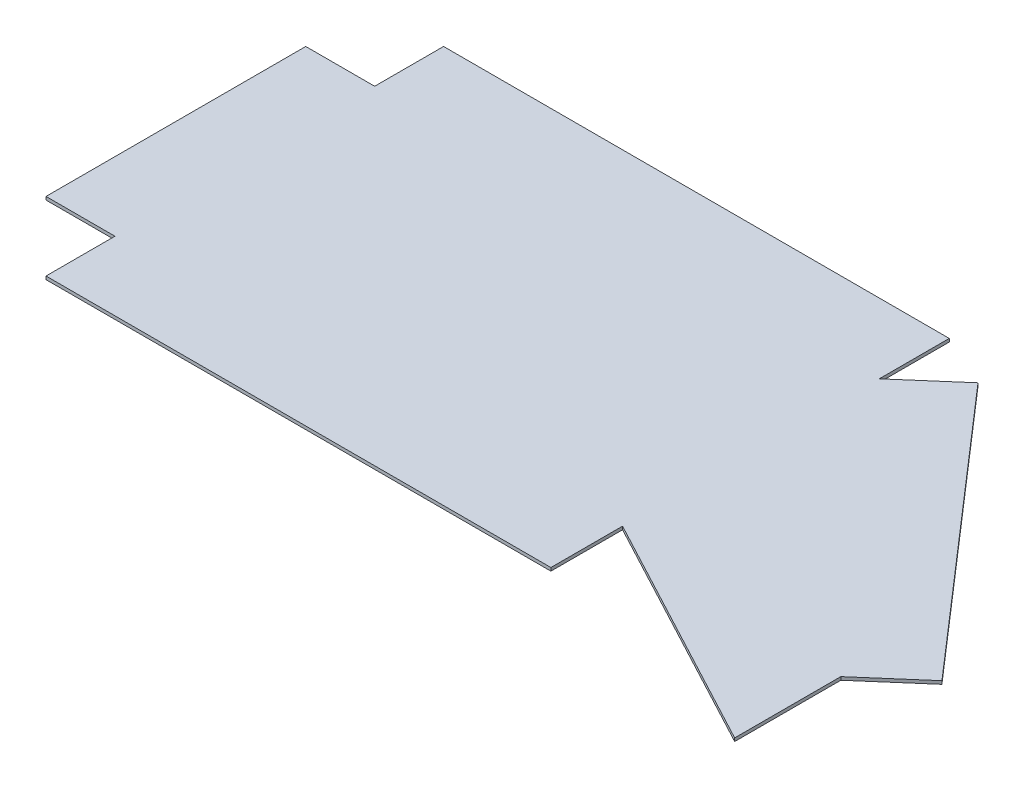
ISO-10303-21;
HEADER;
FILE_DESCRIPTION(('STEP AP214'),'2;1');
FILE_NAME('part.step','',(''),(''),'','','');
FILE_SCHEMA(('AUTOMOTIVE_DESIGN { 1 0 10303 214 1 1 1 1 }'));
ENDSEC;
DATA;
#1=APPLICATION_CONTEXT('core data for automotive mechanical design processes');
#2=APPLICATION_PROTOCOL_DEFINITION('international standard','automotive_design',2000,#1);
#3=PRODUCT_CONTEXT('',#1,'mechanical');
#4=PRODUCT('Part','Part','',(#3));
#5=PRODUCT_RELATED_PRODUCT_CATEGORY('part','',(#4));
#6=PRODUCT_DEFINITION_FORMATION('','',#4);
#7=PRODUCT_DEFINITION_CONTEXT('part definition',#1,'design');
#8=PRODUCT_DEFINITION('design','',#6,#7);
#9=PRODUCT_DEFINITION_SHAPE('','',#8);
#10=(LENGTH_UNIT() NAMED_UNIT(*) SI_UNIT(.MILLI.,.METRE.));
#11=(NAMED_UNIT(*) PLANE_ANGLE_UNIT() SI_UNIT($,.RADIAN.));
#12=(NAMED_UNIT(*) SI_UNIT($,.STERADIAN.) SOLID_ANGLE_UNIT());
#13=UNCERTAINTY_MEASURE_WITH_UNIT(LENGTH_MEASURE(1.E-05),#10,'distance_accuracy_value','');
#14=(GEOMETRIC_REPRESENTATION_CONTEXT(3) GLOBAL_UNCERTAINTY_ASSIGNED_CONTEXT((#13)) GLOBAL_UNIT_ASSIGNED_CONTEXT((#10,
#11,#12)) REPRESENTATION_CONTEXT('',''));
#15=CARTESIAN_POINT('',(0.,0.,0.));
#16=DIRECTION('',(0.,0.,1.));
#17=DIRECTION('',(1.,0.,0.));
#18=AXIS2_PLACEMENT_3D('',#15,#16,#17);
#19=CARTESIAN_POINT('',(0.,1.5,9.99163001597254));
#20=DIRECTION('',(-1.,0.,0.));
#21=DIRECTION('',(0.,0.,1.));
#22=AXIS2_PLACEMENT_3D('',#19,#20,#21);
#23=PLANE('',#22);
#24=DIRECTION('',(0.,0.,-1.));
#25=VECTOR('',#24,1.);
#26=CARTESIAN_POINT('',(0.,0.,9.99163001597254));
#27=LINE('',#26,#25);
#28=CARTESIAN_POINT('',(0.,0.,60.0831657777462));
#29=VERTEX_POINT('',#28);
#30=CARTESIAN_POINT('',(0.,0.,9.99163001597256));
#31=VERTEX_POINT('',#30);
#32=EDGE_CURVE('E410',#29,#31,#27,.T.);
#33=ORIENTED_EDGE('',*,*,#32,.T.);
#34=DIRECTION('',(0.,-1.,0.));
#35=VECTOR('',#34,1.);
#36=CARTESIAN_POINT('',(0.,1.5,9.99163001597254));
#37=LINE('',#36,#35);
#38=CARTESIAN_POINT('',(0.,1.5,9.99163001597256));
#39=VERTEX_POINT('',#38);
#40=EDGE_CURVE('E183',#39,#31,#37,.T.);
#41=ORIENTED_EDGE('',*,*,#40,.F.);
#42=DIRECTION('',(0.,0.,-1.));
#43=VECTOR('',#42,1.);
#44=CARTESIAN_POINT('',(0.,1.5,9.99163001597254));
#45=LINE('',#44,#43);
#46=CARTESIAN_POINT('',(0.,1.5,60.0831657777462));
#47=VERTEX_POINT('',#46);
#48=EDGE_CURVE('E413',#47,#39,#45,.T.);
#49=ORIENTED_EDGE('',*,*,#48,.F.);
#50=DIRECTION('',(0.,-1.,0.));
#51=VECTOR('',#50,1.);
#52=CARTESIAN_POINT('',(0.,1.5,60.0831657777462));
#53=LINE('',#52,#51);
#54=EDGE_CURVE('E419',#47,#29,#53,.T.);
#55=ORIENTED_EDGE('',*,*,#54,.T.);
#56=EDGE_LOOP('',(#33,#41,#49,#55));
#57=FACE_BOUND('',#56,.T.);
#58=ADVANCED_FACE('F174',(#57),#23,.F.);
#59=CARTESIAN_POINT('',(-113.,1.5,0.));
#60=DIRECTION('',(0.469471562785885,0.,-0.88294759285893));
#61=DIRECTION('',(-0.88294759285893,0.,-0.469471562785885));
#62=AXIS2_PLACEMENT_3D('',#59,#60,#61);
#63=PLANE('',#62);
#64=DIRECTION('',(0.88294759285893,0.,0.469471562785885));
#65=VECTOR('',#64,1.);
#66=CARTESIAN_POINT('',(-113.,0.,0.));
#67=LINE('',#66,#65);
#68=CARTESIAN_POINT('',(-113.,0.,0.));
#69=VERTEX_POINT('',#68);
#70=EDGE_CURVE('E416',#69,#29,#67,.T.);
#71=ORIENTED_EDGE('',*,*,#70,.T.);
#72=ORIENTED_EDGE('',*,*,#54,.F.);
#73=DIRECTION('',(0.88294759285893,0.,0.469471562785885));
#74=VECTOR('',#73,1.);
#75=CARTESIAN_POINT('',(-113.,1.5,0.));
#76=LINE('',#75,#74);
#77=CARTESIAN_POINT('',(-113.,1.5,0.));
#78=VERTEX_POINT('',#77);
#79=EDGE_CURVE('E199',#78,#47,#76,.T.);
#80=ORIENTED_EDGE('',*,*,#79,.F.);
#81=DIRECTION('',(0.,-1.,0.));
#82=VECTOR('',#81,1.);
#83=CARTESIAN_POINT('',(-113.,1.5,0.));
#84=LINE('',#83,#82);
#85=EDGE_CURVE('E13',#78,#69,#84,.T.);
#86=ORIENTED_EDGE('',*,*,#85,.T.);
#87=EDGE_LOOP('',(#71,#72,#80,#86));
#88=FACE_BOUND('',#87,.T.);
#89=ADVANCED_FACE('F438',(#88),#63,.F.);
#90=CARTESIAN_POINT('',(0.,1.5,0.));
#91=DIRECTION('',(0.,-1.,0.));
#92=DIRECTION('',(0.,0.,-1.));
#93=AXIS2_PLACEMENT_3D('',#90,#91,#92);
#94=PLANE('',#93);
#95=ORIENTED_EDGE('',*,*,#48,.T.);
#96=DIRECTION('',(0.754709580222769,0.,-0.65605902899051));
#97=VECTOR('',#96,1.);
#98=CARTESIAN_POINT('',(0.,1.5,9.99163001597254));
#99=LINE('',#98,#97);
#100=CARTESIAN_POINT('',(25.5240439667016,1.4999999999998,-12.1960828997195));
#101=VERTEX_POINT('',#100);
#102=EDGE_CURVE('E407',#39,#101,#99,.T.);
#103=ORIENTED_EDGE('',*,*,#102,.T.);
#104=DIRECTION('',(0.656059028990512,0.,0.754709580222768));
#105=VECTOR('',#104,1.);
#106=CARTESIAN_POINT('',(20.5768478869528,1.4999999999998,-17.8871809741901));
#107=LINE('',#106,#105);
#108=CARTESIAN_POINT('',(-87.7134353465758,1.49999999999979,-142.460901615055));
#109=VERTEX_POINT('',#108);
#110=EDGE_CURVE('E398',#101,#109,#107,.F.);
#111=ORIENTED_EDGE('',*,*,#110,.T.);
#112=DIRECTION('',(0.754709580222768,0.,-0.656059028990512));
#113=VECTOR('',#112,1.);
#114=CARTESIAN_POINT('',(-112.618851493927,1.50000000000002,-120.810953658368));
#115=LINE('',#114,#113);
#116=CARTESIAN_POINT('',(-112.638021423708,1.50000000000003,-120.794289492644));
#117=VERTEX_POINT('',#116);
#118=EDGE_CURVE('E395',#109,#117,#115,.F.);
#119=ORIENTED_EDGE('',*,*,#118,.T.);
#120=DIRECTION('',(0.,0.,-1.));
#121=VECTOR('',#120,1.);
#122=CARTESIAN_POINT('',(-112.638021423708,1.50000000000002,-120.819689898686));
#123=LINE('',#122,#121);
#124=CARTESIAN_POINT('',(-112.638021423708,1.4999999999999,-153.819689898686));
#125=VERTEX_POINT('',#124);
#126=EDGE_CURVE('E371',#117,#125,#123,.T.);
#127=ORIENTED_EDGE('',*,*,#126,.T.);
#128=DIRECTION('',(-1.,0.,0.));
#129=VECTOR('',#128,1.);
#130=CARTESIAN_POINT('',(0.,1.49999999999992,-153.819689898686));
#131=LINE('',#130,#129);
#132=CARTESIAN_POINT('',(-351.292893218813,1.49999999999988,-153.819689898686));
#133=VERTEX_POINT('',#132);
#134=EDGE_CURVE('E378',#125,#133,#131,.T.);
#135=ORIENTED_EDGE('',*,*,#134,.T.);
#136=DIRECTION('',(0.,0.,1.));
#137=VECTOR('',#136,1.);
#138=CARTESIAN_POINT('',(-351.292893218813,1.49999999999999,-120.819689898686));
#139=LINE('',#138,#137);
#140=CARTESIAN_POINT('',(-351.292893218813,1.49999999999999,-121.292893218813));
#141=VERTEX_POINT('',#140);
#142=EDGE_CURVE('E375',#133,#141,#139,.T.);
#143=ORIENTED_EDGE('',*,*,#142,.T.);
#144=DIRECTION('',(-1.,0.,0.));
#145=VECTOR('',#144,1.);
#146=CARTESIAN_POINT('',(-350.819689898685,1.5,-121.292893218813));
#147=LINE('',#146,#145);
#148=CARTESIAN_POINT('',(-383.819689898686,1.49999999999978,-121.292893218813));
#149=VERTEX_POINT('',#148);
#150=EDGE_CURVE('E345',#141,#149,#147,.T.);
#151=ORIENTED_EDGE('',*,*,#150,.T.);
#152=DIRECTION('',(0.,0.,1.));
#153=VECTOR('',#152,1.);
#154=CARTESIAN_POINT('',(-383.819689898686,1.49999999999978,0.));
#155=LINE('',#154,#153);
#156=CARTESIAN_POINT('',(-383.819689898686,1.49999999999978,1.29289321881346));
#157=VERTEX_POINT('',#156);
#158=EDGE_CURVE('E352',#149,#157,#155,.T.);
#159=ORIENTED_EDGE('',*,*,#158,.T.);
#160=DIRECTION('',(1.,0.,0.));
#161=VECTOR('',#160,1.);
#162=CARTESIAN_POINT('',(-350.819689898685,1.5,1.29289321881346));
#163=LINE('',#162,#161);
#164=CARTESIAN_POINT('',(-351.292893218813,1.5,1.29289321881346));
#165=VERTEX_POINT('',#164);
#166=EDGE_CURVE('E349',#157,#165,#163,.T.);
#167=ORIENTED_EDGE('',*,*,#166,.T.);
#168=DIRECTION('',(0.,0.,-1.));
#169=VECTOR('',#168,1.);
#170=CARTESIAN_POINT('',(-351.292893218813,1.50000000000002,0.819689898685996));
#171=LINE('',#170,#169);
#172=CARTESIAN_POINT('',(-351.292893218813,1.49999999999979,33.819689898686));
#173=VERTEX_POINT('',#172);
#174=EDGE_CURVE('E307',#165,#173,#171,.F.);
#175=ORIENTED_EDGE('',*,*,#174,.T.);
#176=DIRECTION('',(-1.,0.,0.));
#177=VECTOR('',#176,1.);
#178=CARTESIAN_POINT('',(0.,1.49999999999979,33.819689898686));
#179=LINE('',#178,#177);
#180=CARTESIAN_POINT('',(-113.,1.49999999999979,33.819689898686));
#181=VERTEX_POINT('',#180);
#182=EDGE_CURVE('E302',#173,#181,#179,.F.);
#183=ORIENTED_EDGE('',*,*,#182,.T.);
#184=DIRECTION('',(0.,0.,1.));
#185=VECTOR('',#184,1.);
#186=CARTESIAN_POINT('',(-113.,1.5,2.15984494934299));
#187=LINE('',#186,#185);
#188=EDGE_CURVE('E332',#181,#78,#187,.F.);
#189=ORIENTED_EDGE('',*,*,#188,.T.);
#190=ORIENTED_EDGE('',*,*,#79,.T.);
#191=EDGE_LOOP('',(#95,#103,#111,#119,#127,#135,#143,#151,#159,#167,#175,#183,#189,#190));
#192=FACE_BOUND('',#191,.T.);
#193=ADVANCED_FACE('F442',(#192),#94,.F.);
#194=CARTESIAN_POINT('',(0.,0.,0.));
#195=DIRECTION('',(0.,-1.,0.));
#196=DIRECTION('',(0.,0.,-1.));
#197=AXIS2_PLACEMENT_3D('',#194,#195,#196);
#198=PLANE('',#197);
#199=ORIENTED_EDGE('',*,*,#32,.F.);
#200=ORIENTED_EDGE('',*,*,#70,.F.);
#201=DIRECTION('',(0.,0.,1.));
#202=VECTOR('',#201,1.);
#203=CARTESIAN_POINT('',(-113.,0.,2.15984494934299));
#204=LINE('',#203,#202);
#205=CARTESIAN_POINT('',(-113.,-2.05998412772246E-13,33.819689898686));
#206=VERTEX_POINT('',#205);
#207=EDGE_CURVE('E190',#206,#69,#204,.F.);
#208=ORIENTED_EDGE('',*,*,#207,.F.);
#209=DIRECTION('',(1.,0.,0.));
#210=VECTOR('',#209,1.);
#211=CARTESIAN_POINT('',(-113.,-2.05998412772246E-13,33.819689898686));
#212=LINE('',#211,#210);
#213=CARTESIAN_POINT('',(-351.292893218813,-2.05998412772246E-13,33.819689898686));
#214=VERTEX_POINT('',#213);
#215=EDGE_CURVE('E296',#214,#206,#212,.T.);
#216=ORIENTED_EDGE('',*,*,#215,.F.);
#217=DIRECTION('',(0.,0.,1.));
#218=VECTOR('',#217,1.);
#219=CARTESIAN_POINT('',(-351.292893218813,-2.05998412772246E-13,33.819689898686));
#220=LINE('',#219,#218);
#221=CARTESIAN_POINT('',(-351.292893218813,0.,1.29289321881346));
#222=VERTEX_POINT('',#221);
#223=EDGE_CURVE('E293',#222,#214,#220,.T.);
#224=ORIENTED_EDGE('',*,*,#223,.F.);
#225=DIRECTION('',(-1.,0.,0.));
#226=VECTOR('',#225,1.);
#227=CARTESIAN_POINT('',(-383.819689898686,-2.22044604925031E-13,1.29289321881346));
#228=LINE('',#227,#226);
#229=CARTESIAN_POINT('',(-383.819689898686,-2.22044604925031E-13,1.29289321881346));
#230=VERTEX_POINT('',#229);
#231=EDGE_CURVE('E279',#230,#222,#228,.F.);
#232=ORIENTED_EDGE('',*,*,#231,.F.);
#233=DIRECTION('',(0.,0.,-1.));
#234=VECTOR('',#233,1.);
#235=CARTESIAN_POINT('',(-383.819689898686,-2.22044604925031E-13,-120.));
#236=LINE('',#235,#234);
#237=CARTESIAN_POINT('',(-383.819689898686,-2.22044604925031E-13,-121.292893218813));
#238=VERTEX_POINT('',#237);
#239=EDGE_CURVE('E335',#238,#230,#236,.F.);
#240=ORIENTED_EDGE('',*,*,#239,.F.);
#241=DIRECTION('',(1.,0.,0.));
#242=VECTOR('',#241,1.);
#243=CARTESIAN_POINT('',(-352.319689898686,0.,-121.292893218813));
#244=LINE('',#243,#242);
#245=CARTESIAN_POINT('',(-351.292893218813,0.,-121.292893218813));
#246=VERTEX_POINT('',#245);
#247=EDGE_CURVE('E341',#246,#238,#244,.F.);
#248=ORIENTED_EDGE('',*,*,#247,.F.);
#249=DIRECTION('',(0.,0.,-1.));
#250=VECTOR('',#249,1.);
#251=CARTESIAN_POINT('',(-351.292893218813,-1.2490009027033E-13,-153.819689898686));
#252=LINE('',#251,#250);
#253=CARTESIAN_POINT('',(-351.292893218813,-1.2490009027033E-13,-153.819689898686));
#254=VERTEX_POINT('',#253);
#255=EDGE_CURVE('E359',#254,#246,#252,.F.);
#256=ORIENTED_EDGE('',*,*,#255,.F.);
#257=DIRECTION('',(1.,0.,0.));
#258=VECTOR('',#257,1.);
#259=CARTESIAN_POINT('',(-113.,0.,-153.819689898686));
#260=LINE('',#259,#258);
#261=CARTESIAN_POINT('',(-112.638021423708,0.,-153.819689898686));
#262=VERTEX_POINT('',#261);
#263=EDGE_CURVE('E289',#262,#254,#260,.F.);
#264=ORIENTED_EDGE('',*,*,#263,.F.);
#265=DIRECTION('',(0.,0.,1.));
#266=VECTOR('',#265,1.);
#267=CARTESIAN_POINT('',(-112.638021423708,0.,-122.319689898686));
#268=LINE('',#267,#266);
#269=CARTESIAN_POINT('',(-112.638021423708,0.,-120.794289492644));
#270=VERTEX_POINT('',#269);
#271=EDGE_CURVE('E367',#270,#262,#268,.F.);
#272=ORIENTED_EDGE('',*,*,#271,.F.);
#273=DIRECTION('',(-0.754709580222768,0.,0.656059028990512));
#274=VECTOR('',#273,1.);
#275=CARTESIAN_POINT('',(-111.486787123593,0.,-121.795042201854));
#276=LINE('',#275,#274);
#277=CARTESIAN_POINT('',(-87.7134353465758,-2.00794242344315E-13,-142.460901615055));
#278=VERTEX_POINT('',#277);
#279=EDGE_CURVE('E387',#278,#270,#276,.T.);
#280=ORIENTED_EDGE('',*,*,#279,.F.);
#281=DIRECTION('',(-0.656059028990512,0.,-0.754709580222768));
#282=VECTOR('',#281,1.);
#283=CARTESIAN_POINT('',(-87.4759560332985,-2.1467203015213E-13,-142.187712915692));
#284=LINE('',#283,#282);
#285=CARTESIAN_POINT('',(25.5240439667016,-1.93855348440408E-13,-12.1960828997195));
#286=VERTEX_POINT('',#285);
#287=EDGE_CURVE('E362',#286,#278,#284,.T.);
#288=ORIENTED_EDGE('',*,*,#287,.F.);
#289=DIRECTION('',(0.754709580222769,0.,-0.65605902899051));
#290=VECTOR('',#289,1.);
#291=CARTESIAN_POINT('',(0.,0.,9.99163001597254));
#292=LINE('',#291,#290);
#293=EDGE_CURVE('E390',#31,#286,#292,.T.);
#294=ORIENTED_EDGE('',*,*,#293,.F.);
#295=EDGE_LOOP('',(#199,#200,#208,#216,#224,#232,#240,#248,#256,#264,#272,#280,#288,#294));
#296=FACE_BOUND('',#295,.T.);
#297=ADVANCED_FACE('F176',(#296),#198,.T.);
#298=CARTESIAN_POINT('',(0.,0.75,9.99163001597254));
#299=DIRECTION('',(0.656059028990511,0.,0.754709580222769));
#300=DIRECTION('',(0.754709580222769,0.,-0.65605902899051));
#301=AXIS2_PLACEMENT_3D('',#298,#299,#300);
#302=PLANE('',#301);
#303=ORIENTED_EDGE('',*,*,#40,.T.);
#304=ORIENTED_EDGE('',*,*,#293,.T.);
#305=DIRECTION('',(0.,1.,0.));
#306=VECTOR('',#305,1.);
#307=CARTESIAN_POINT('',(25.5240439667016,-2.04697370165263E-13,-12.1960828997195));
#308=LINE('',#307,#306);
#309=EDGE_CURVE('E391',#286,#101,#308,.T.);
#310=ORIENTED_EDGE('',*,*,#309,.T.);
#311=ORIENTED_EDGE('',*,*,#102,.F.);
#312=EDGE_LOOP('',(#303,#304,#310,#311));
#313=FACE_BOUND('',#312,.T.);
#314=ADVANCED_FACE('F431',(#313),#302,.T.);
#315=CARTESIAN_POINT('',(-87.4759560332985,-2.1467203015213E-13,-142.187712915692));
#316=DIRECTION('',(0.754709580222768,0.,-0.656059028990512));
#317=DIRECTION('',(-0.430413449519969,0.754709580222768,-0.49513403437079));
#318=AXIS2_PLACEMENT_3D('',#315,#316,#317);
#319=PLANE('',#318);
#320=ORIENTED_EDGE('',*,*,#110,.F.);
#321=ORIENTED_EDGE('',*,*,#309,.F.);
#322=ORIENTED_EDGE('',*,*,#287,.T.);
#323=DIRECTION('',(0.,1.,0.));
#324=VECTOR('',#323,1.);
#325=CARTESIAN_POINT('',(-87.7134353465758,-2.00794242344315E-13,-142.460901615055));
#326=LINE('',#325,#324);
#327=EDGE_CURVE('E401',#278,#109,#326,.T.);
#328=ORIENTED_EDGE('',*,*,#327,.T.);
#329=EDGE_LOOP('',(#320,#321,#322,#328));
#330=FACE_BOUND('',#329,.T.);
#331=ADVANCED_FACE('F470',(#330),#319,.T.);
#332=CARTESIAN_POINT('',(-111.486787123593,0.,-121.795042201854));
#333=DIRECTION('',(-0.656059028990512,0.,-0.754709580222768));
#334=DIRECTION('',(0.,1.,0.));
#335=AXIS2_PLACEMENT_3D('',#332,#333,#334);
#336=PLANE('',#335);
#337=ORIENTED_EDGE('',*,*,#279,.T.);
#338=DIRECTION('',(0.,1.,0.));
#339=VECTOR('',#338,1.);
#340=CARTESIAN_POINT('',(-112.638021423708,0.,-120.794289492644));
#341=LINE('',#340,#339);
#342=EDGE_CURVE('E313',#270,#117,#341,.T.);
#343=ORIENTED_EDGE('',*,*,#342,.T.);
#344=ORIENTED_EDGE('',*,*,#118,.F.);
#345=ORIENTED_EDGE('',*,*,#327,.F.);
#346=EDGE_LOOP('',(#337,#343,#344,#345));
#347=FACE_BOUND('',#346,.T.);
#348=ADVANCED_FACE('F466',(#347),#336,.T.);
#349=CARTESIAN_POINT('',(-113.,0.,-153.819689898686));
#350=DIRECTION('',(0.,0.,-1.));
#351=DIRECTION('',(0.,1.,0.));
#352=AXIS2_PLACEMENT_3D('',#349,#350,#351);
#353=PLANE('',#352);
#354=ORIENTED_EDGE('',*,*,#134,.F.);
#355=DIRECTION('',(0.,1.,0.));
#356=VECTOR('',#355,1.);
#357=CARTESIAN_POINT('',(-112.638021423708,0.,-153.819689898686));
#358=LINE('',#357,#356);
#359=EDGE_CURVE('E363',#262,#125,#358,.T.);
#360=ORIENTED_EDGE('',*,*,#359,.F.);
#361=ORIENTED_EDGE('',*,*,#263,.T.);
#362=DIRECTION('',(0.,1.,0.));
#363=VECTOR('',#362,1.);
#364=CARTESIAN_POINT('',(-351.292893218813,-1.2490009027033E-13,-153.819689898686));
#365=LINE('',#364,#363);
#366=EDGE_CURVE('E381',#254,#133,#365,.T.);
#367=ORIENTED_EDGE('',*,*,#366,.T.);
#368=EDGE_LOOP('',(#354,#360,#361,#367));
#369=FACE_BOUND('',#368,.T.);
#370=ADVANCED_FACE('F463',(#369),#353,.T.);
#371=CARTESIAN_POINT('',(-112.638021423708,0.,-122.319689898686));
#372=DIRECTION('',(1.,0.,0.));
#373=DIRECTION('',(0.,-1.,0.));
#374=AXIS2_PLACEMENT_3D('',#371,#372,#373);
#375=PLANE('',#374);
#376=ORIENTED_EDGE('',*,*,#126,.F.);
#377=ORIENTED_EDGE('',*,*,#342,.F.);
#378=ORIENTED_EDGE('',*,*,#271,.T.);
#379=ORIENTED_EDGE('',*,*,#359,.T.);
#380=EDGE_LOOP('',(#376,#377,#378,#379));
#381=FACE_BOUND('',#380,.T.);
#382=ADVANCED_FACE('F462',(#381),#375,.T.);
#383=CARTESIAN_POINT('',(-351.292893218813,-1.2490009027033E-13,-153.819689898686));
#384=DIRECTION('',(-1.,0.,0.));
#385=DIRECTION('',(0.,1.,0.));
#386=AXIS2_PLACEMENT_3D('',#383,#384,#385);
#387=PLANE('',#386);
#388=ORIENTED_EDGE('',*,*,#255,.T.);
#389=DIRECTION('',(0.,1.,0.));
#390=VECTOR('',#389,1.);
#391=CARTESIAN_POINT('',(-351.292893218813,0.,-121.292893218813));
#392=LINE('',#391,#390);
#393=EDGE_CURVE('E309',#246,#141,#392,.T.);
#394=ORIENTED_EDGE('',*,*,#393,.T.);
#395=ORIENTED_EDGE('',*,*,#142,.F.);
#396=ORIENTED_EDGE('',*,*,#366,.F.);
#397=EDGE_LOOP('',(#388,#394,#395,#396));
#398=FACE_BOUND('',#397,.T.);
#399=ADVANCED_FACE('F454',(#398),#387,.T.);
#400=CARTESIAN_POINT('',(-383.819689898686,-2.22044604925031E-13,-120.));
#401=DIRECTION('',(-1.,0.,0.));
#402=DIRECTION('',(0.,-1.,0.));
#403=AXIS2_PLACEMENT_3D('',#400,#401,#402);
#404=PLANE('',#403);
#405=ORIENTED_EDGE('',*,*,#158,.F.);
#406=DIRECTION('',(0.,1.,0.));
#407=VECTOR('',#406,1.);
#408=CARTESIAN_POINT('',(-383.819689898686,-2.22044604925031E-13,-121.292893218813));
#409=LINE('',#408,#407);
#410=EDGE_CURVE('E290',#238,#149,#409,.T.);
#411=ORIENTED_EDGE('',*,*,#410,.F.);
#412=ORIENTED_EDGE('',*,*,#239,.T.);
#413=DIRECTION('',(0.,1.,0.));
#414=VECTOR('',#413,1.);
#415=CARTESIAN_POINT('',(-383.819689898686,-2.22044604925031E-13,1.29289321881346));
#416=LINE('',#415,#414);
#417=EDGE_CURVE('E286',#230,#157,#416,.T.);
#418=ORIENTED_EDGE('',*,*,#417,.T.);
#419=EDGE_LOOP('',(#405,#411,#412,#418));
#420=FACE_BOUND('',#419,.T.);
#421=ADVANCED_FACE('F444',(#420),#404,.T.);
#422=CARTESIAN_POINT('',(-352.319689898686,0.,-121.292893218813));
#423=DIRECTION('',(0.,0.,-1.));
#424=DIRECTION('',(0.,-1.,0.));
#425=AXIS2_PLACEMENT_3D('',#422,#423,#424);
#426=PLANE('',#425);
#427=ORIENTED_EDGE('',*,*,#150,.F.);
#428=ORIENTED_EDGE('',*,*,#393,.F.);
#429=ORIENTED_EDGE('',*,*,#247,.T.);
#430=ORIENTED_EDGE('',*,*,#410,.T.);
#431=EDGE_LOOP('',(#427,#428,#429,#430));
#432=FACE_BOUND('',#431,.T.);
#433=ADVANCED_FACE('F451',(#432),#426,.T.);
#434=CARTESIAN_POINT('',(-383.819689898686,-2.22044604925031E-13,1.29289321881346));
#435=DIRECTION('',(0.,0.,1.));
#436=DIRECTION('',(0.,1.,0.));
#437=AXIS2_PLACEMENT_3D('',#434,#435,#436);
#438=PLANE('',#437);
#439=ORIENTED_EDGE('',*,*,#231,.T.);
#440=DIRECTION('',(0.,1.,0.));
#441=VECTOR('',#440,1.);
#442=CARTESIAN_POINT('',(-351.292893218813,0.,1.29289321881346));
#443=LINE('',#442,#441);
#444=EDGE_CURVE('E284',#222,#165,#443,.T.);
#445=ORIENTED_EDGE('',*,*,#444,.T.);
#446=ORIENTED_EDGE('',*,*,#166,.F.);
#447=ORIENTED_EDGE('',*,*,#417,.F.);
#448=EDGE_LOOP('',(#439,#445,#446,#447));
#449=FACE_BOUND('',#448,.T.);
#450=ADVANCED_FACE('F281',(#449),#438,.T.);
#451=CARTESIAN_POINT('',(-113.,0.75,2.15984494934299));
#452=DIRECTION('',(-1.,0.,0.));
#453=DIRECTION('',(0.,0.,1.));
#454=AXIS2_PLACEMENT_3D('',#451,#452,#453);
#455=PLANE('',#454);
#456=ORIENTED_EDGE('',*,*,#207,.T.);
#457=ORIENTED_EDGE('',*,*,#85,.F.);
#458=ORIENTED_EDGE('',*,*,#188,.F.);
#459=DIRECTION('',(0.,1.,0.));
#460=VECTOR('',#459,1.);
#461=CARTESIAN_POINT('',(-113.,-2.05998412772246E-13,33.819689898686));
#462=LINE('',#461,#460);
#463=EDGE_CURVE('E326',#206,#181,#462,.T.);
#464=ORIENTED_EDGE('',*,*,#463,.F.);
#465=EDGE_LOOP('',(#456,#457,#458,#464));
#466=FACE_BOUND('',#465,.T.);
#467=ADVANCED_FACE('F439',(#466),#455,.F.);
#468=CARTESIAN_POINT('',(-113.,-2.05998412772246E-13,33.819689898686));
#469=DIRECTION('',(0.,0.,1.));
#470=DIRECTION('',(0.,-1.,0.));
#471=AXIS2_PLACEMENT_3D('',#468,#469,#470);
#472=PLANE('',#471);
#473=ORIENTED_EDGE('',*,*,#182,.F.);
#474=DIRECTION('',(0.,1.,0.));
#475=VECTOR('',#474,1.);
#476=CARTESIAN_POINT('',(-351.292893218813,-2.05998412772246E-13,33.819689898686));
#477=LINE('',#476,#475);
#478=EDGE_CURVE('E301',#214,#173,#477,.T.);
#479=ORIENTED_EDGE('',*,*,#478,.F.);
#480=ORIENTED_EDGE('',*,*,#215,.T.);
#481=ORIENTED_EDGE('',*,*,#463,.T.);
#482=EDGE_LOOP('',(#473,#479,#480,#481));
#483=FACE_BOUND('',#482,.T.);
#484=ADVANCED_FACE('F441',(#483),#472,.T.);
#485=CARTESIAN_POINT('',(-351.292893218813,-2.05998412772246E-13,33.819689898686));
#486=DIRECTION('',(-1.,0.,0.));
#487=DIRECTION('',(0.,-1.,0.));
#488=AXIS2_PLACEMENT_3D('',#485,#486,#487);
#489=PLANE('',#488);
#490=ORIENTED_EDGE('',*,*,#174,.F.);
#491=ORIENTED_EDGE('',*,*,#444,.F.);
#492=ORIENTED_EDGE('',*,*,#223,.T.);
#493=ORIENTED_EDGE('',*,*,#478,.T.);
#494=EDGE_LOOP('',(#490,#491,#492,#493));
#495=FACE_BOUND('',#494,.T.);
#496=ADVANCED_FACE('F305',(#495),#489,.T.);
#497=CLOSED_SHELL('',(#58,#89,#193,#297,#314,#331,#348,#370,#382,#399,#421,#433,#450,#467,#484,#496));
#498=MANIFOLD_SOLID_BREP('B2',#497);
#499=ADVANCED_BREP_SHAPE_REPRESENTATION('',(#18,#498),#14);
#500=SHAPE_DEFINITION_REPRESENTATION(#9,#499);
ENDSEC;
END-ISO-10303-21;
